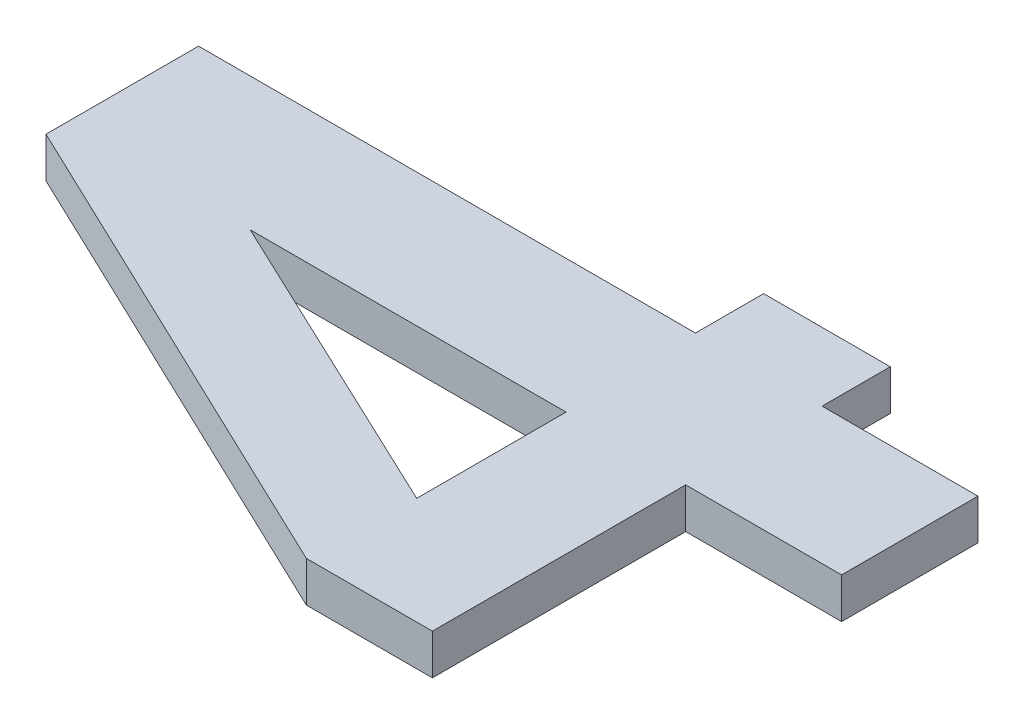
ISO-10303-21;
HEADER;
FILE_DESCRIPTION(('STEP AP214'),'2;1');
FILE_NAME('part.step','',(''),(''),'','','');
FILE_SCHEMA(('AUTOMOTIVE_DESIGN { 1 0 10303 214 1 1 1 1 }'));
ENDSEC;
DATA;
#1=APPLICATION_CONTEXT('core data for automotive mechanical design processes');
#2=APPLICATION_PROTOCOL_DEFINITION('international standard','automotive_design',2000,#1);
#3=PRODUCT_CONTEXT('',#1,'mechanical');
#4=PRODUCT('Part','Part','',(#3));
#5=PRODUCT_RELATED_PRODUCT_CATEGORY('part','',(#4));
#6=PRODUCT_DEFINITION_FORMATION('','',#4);
#7=PRODUCT_DEFINITION_CONTEXT('part definition',#1,'design');
#8=PRODUCT_DEFINITION('design','',#6,#7);
#9=PRODUCT_DEFINITION_SHAPE('','',#8);
#10=(LENGTH_UNIT() NAMED_UNIT(*) SI_UNIT(.MILLI.,.METRE.));
#11=(NAMED_UNIT(*) PLANE_ANGLE_UNIT() SI_UNIT($,.RADIAN.));
#12=(NAMED_UNIT(*) SI_UNIT($,.STERADIAN.) SOLID_ANGLE_UNIT());
#13=UNCERTAINTY_MEASURE_WITH_UNIT(LENGTH_MEASURE(1.E-05),#10,'distance_accuracy_value','');
#14=(GEOMETRIC_REPRESENTATION_CONTEXT(3) GLOBAL_UNCERTAINTY_ASSIGNED_CONTEXT((#13)) GLOBAL_UNIT_ASSIGNED_CONTEXT((#10,
#11,#12)) REPRESENTATION_CONTEXT('',''));
#15=CARTESIAN_POINT('',(0.,0.,0.));
#16=DIRECTION('',(0.,0.,1.));
#17=DIRECTION('',(1.,0.,0.));
#18=AXIS2_PLACEMENT_3D('',#15,#16,#17);
#19=CARTESIAN_POINT('',(0.,2.9906,0.));
#20=DIRECTION('',(0.,-1.,0.));
#21=DIRECTION('',(-1.,0.,0.));
#22=AXIS2_PLACEMENT_3D('',#19,#20,#21);
#23=PLANE('',#22);
#24=DIRECTION('',(0.,0.,1.));
#25=VECTOR('',#24,1.);
#26=CARTESIAN_POINT('',(2.3542541336,2.9906,0.647489118388803));
#27=LINE('',#26,#25);
#28=CARTESIAN_POINT('',(2.3542541336,2.9906,0.647489118388803));
#29=VERTEX_POINT('',#28);
#30=CARTESIAN_POINT('',(2.3542541336,2.9906,0.849711340611025));
#31=VERTEX_POINT('',#30);
#32=EDGE_CURVE('E11',#29,#31,#27,.T.);
#33=ORIENTED_EDGE('',*,*,#32,.F.);
#34=DIRECTION('',(1.,0.,0.));
#35=VECTOR('',#34,1.);
#36=CARTESIAN_POINT('',(2.1231430224888,2.9906,0.647489118388803));
#37=LINE('',#36,#35);
#38=CARTESIAN_POINT('',(2.1231430224888,2.9906,0.647489118388803));
#39=VERTEX_POINT('',#38);
#40=EDGE_CURVE('E24',#39,#29,#37,.T.);
#41=ORIENTED_EDGE('',*,*,#40,.F.);
#42=DIRECTION('',(0.,0.,1.));
#43=VECTOR('',#42,1.);
#44=CARTESIAN_POINT('',(2.1231430224888,2.9906,0.546378007277692));
#45=LINE('',#44,#43);
#46=CARTESIAN_POINT('',(2.1231430224888,2.9906,0.546378007277692));
#47=VERTEX_POINT('',#46);
#48=EDGE_CURVE('E227',#47,#39,#45,.T.);
#49=ORIENTED_EDGE('',*,*,#48,.F.);
#50=DIRECTION('',(1.,0.,0.));
#51=VECTOR('',#50,1.);
#52=CARTESIAN_POINT('',(1.9353652447111,2.9906,0.546378007277692));
#53=LINE('',#52,#51);
#54=CARTESIAN_POINT('',(1.9353652447111,2.9906,0.546378007277692));
#55=VERTEX_POINT('',#54);
#56=EDGE_CURVE('E224',#55,#47,#53,.T.);
#57=ORIENTED_EDGE('',*,*,#56,.F.);
#58=DIRECTION('',(0.,0.,-1.));
#59=VECTOR('',#58,1.);
#60=CARTESIAN_POINT('',(1.9353652447111,2.9906,0.647489118388803));
#61=LINE('',#60,#59);
#62=CARTESIAN_POINT('',(1.9353652447111,2.9906,0.647489118388803));
#63=VERTEX_POINT('',#62);
#64=EDGE_CURVE('E221',#63,#55,#61,.T.);
#65=ORIENTED_EDGE('',*,*,#64,.F.);
#66=DIRECTION('',(1.,0.,0.));
#67=VECTOR('',#66,1.);
#68=CARTESIAN_POINT('',(1.1986985780444,2.9906,0.647489118388803));
#69=LINE('',#68,#67);
#70=CARTESIAN_POINT('',(1.1986985780444,2.9906,0.647489118388803));
#71=VERTEX_POINT('',#70);
#72=EDGE_CURVE('E218',#71,#63,#69,.T.);
#73=ORIENTED_EDGE('',*,*,#72,.F.);
#74=DIRECTION('',(0.,0.,-1.));
#75=VECTOR('',#74,1.);
#76=CARTESIAN_POINT('',(1.1986985780444,2.9906,0.873634951722136));
#77=LINE('',#76,#75);
#78=CARTESIAN_POINT('',(1.1986985780444,2.9906,0.873634951722136));
#79=VERTEX_POINT('',#78);
#80=EDGE_CURVE('E215',#79,#71,#77,.T.);
#81=ORIENTED_EDGE('',*,*,#80,.F.);
#82=DIRECTION('',(-0.902666413566439,0.,-0.430340964607256));
#83=VECTOR('',#82,1.);
#84=CARTESIAN_POINT('',(1.9362680224888,2.9906,1.2252668961666));
#85=LINE('',#84,#83);
#86=CARTESIAN_POINT('',(1.9362680224888,2.9906,1.2252668961666));
#87=VERTEX_POINT('',#86);
#88=EDGE_CURVE('E212',#87,#79,#85,.T.);
#89=ORIENTED_EDGE('',*,*,#88,.F.);
#90=DIRECTION('',(-1.,0.,0.));
#91=VECTOR('',#90,1.);
#92=CARTESIAN_POINT('',(2.1231430224888,2.9906,1.2252668961666));
#93=LINE('',#92,#91);
#94=CARTESIAN_POINT('',(2.1231430224888,2.9906,1.2252668961666));
#95=VERTEX_POINT('',#94);
#96=EDGE_CURVE('E209',#95,#87,#93,.T.);
#97=ORIENTED_EDGE('',*,*,#96,.F.);
#98=DIRECTION('',(0.,0.,1.));
#99=VECTOR('',#98,1.);
#100=CARTESIAN_POINT('',(2.1231430224888,2.9906,0.849711340611025));
#101=LINE('',#100,#99);
#102=CARTESIAN_POINT('',(2.1231430224888,2.9906,0.849711340611025));
#103=VERTEX_POINT('',#102);
#104=EDGE_CURVE('E206',#103,#95,#101,.T.);
#105=ORIENTED_EDGE('',*,*,#104,.F.);
#106=DIRECTION('',(-1.,0.,0.));
#107=VECTOR('',#106,1.);
#108=CARTESIAN_POINT('',(2.3542541336,2.9906,0.849711340611025));
#109=LINE('',#108,#107);
#110=EDGE_CURVE('E203',#31,#103,#109,.T.);
#111=ORIENTED_EDGE('',*,*,#110,.F.);
#112=EDGE_LOOP('',(#33,#41,#49,#57,#65,#73,#81,#89,#97,#105,#111));
#113=FACE_BOUND('',#112,.T.);
#114=DIRECTION('',(0.904056962031246,0.,0.427411990242242));
#115=VECTOR('',#114,1.);
#116=CARTESIAN_POINT('',(1.4726916336,2.9906,0.844971757277692));
#117=LINE('',#116,#115);
#118=CARTESIAN_POINT('',(1.4726916336,2.9906,0.844971757277692));
#119=VERTEX_POINT('',#118);
#120=CARTESIAN_POINT('',(1.9410076058222,2.9906,1.0663780072777));
#121=VERTEX_POINT('',#120);
#122=EDGE_CURVE('E135',#119,#121,#117,.T.);
#123=ORIENTED_EDGE('',*,*,#122,.F.);
#124=DIRECTION('',(-1.,0.,0.));
#125=VECTOR('',#124,1.);
#126=CARTESIAN_POINT('',(1.9410076058222,2.9906,0.844971757277692));
#127=LINE('',#126,#125);
#128=CARTESIAN_POINT('',(1.9410076058222,2.9906,0.844971757277692));
#129=VERTEX_POINT('',#128);
#130=EDGE_CURVE('E199',#129,#119,#127,.T.);
#131=ORIENTED_EDGE('',*,*,#130,.F.);
#132=DIRECTION('',(0.,0.,-1.));
#133=VECTOR('',#132,1.);
#134=CARTESIAN_POINT('',(1.9410076058222,2.9906,1.0663780072777));
#135=LINE('',#134,#133);
#136=EDGE_CURVE('E197',#121,#129,#135,.T.);
#137=ORIENTED_EDGE('',*,*,#136,.F.);
#138=EDGE_LOOP('',(#123,#131,#137));
#139=FACE_BOUND('',#138,.T.);
#140=ADVANCED_FACE('F17',(#113,#139),#23,.F.);
#141=CARTESIAN_POINT('',(0.,2.9306,0.));
#142=DIRECTION('',(0.,-1.,0.));
#143=DIRECTION('',(-1.,0.,0.));
#144=AXIS2_PLACEMENT_3D('',#141,#142,#143);
#145=PLANE('',#144);
#146=DIRECTION('',(0.,0.,1.));
#147=VECTOR('',#146,1.);
#148=CARTESIAN_POINT('',(2.3542541336,2.9306,0.647489118388803));
#149=LINE('',#148,#147);
#150=CARTESIAN_POINT('',(2.3542541336,2.9306,0.647489118388803));
#151=VERTEX_POINT('',#150);
#152=CARTESIAN_POINT('',(2.3542541336,2.9306,0.849711340611025));
#153=VERTEX_POINT('',#152);
#154=EDGE_CURVE('E195',#151,#153,#149,.T.);
#155=ORIENTED_EDGE('',*,*,#154,.T.);
#156=DIRECTION('',(-1.,0.,0.));
#157=VECTOR('',#156,1.);
#158=CARTESIAN_POINT('',(2.3542541336,2.9306,0.849711340611025));
#159=LINE('',#158,#157);
#160=CARTESIAN_POINT('',(2.1231430224888,2.9306,0.849711340611025));
#161=VERTEX_POINT('',#160);
#162=EDGE_CURVE('E193',#153,#161,#159,.T.);
#163=ORIENTED_EDGE('',*,*,#162,.T.);
#164=DIRECTION('',(0.,0.,1.));
#165=VECTOR('',#164,1.);
#166=CARTESIAN_POINT('',(2.1231430224888,2.9306,0.849711340611025));
#167=LINE('',#166,#165);
#168=CARTESIAN_POINT('',(2.1231430224888,2.9306,1.2252668961666));
#169=VERTEX_POINT('',#168);
#170=EDGE_CURVE('E191',#161,#169,#167,.T.);
#171=ORIENTED_EDGE('',*,*,#170,.T.);
#172=DIRECTION('',(-1.,0.,0.));
#173=VECTOR('',#172,1.);
#174=CARTESIAN_POINT('',(2.1231430224888,2.9306,1.2252668961666));
#175=LINE('',#174,#173);
#176=CARTESIAN_POINT('',(1.9362680224888,2.9306,1.2252668961666));
#177=VERTEX_POINT('',#176);
#178=EDGE_CURVE('E189',#169,#177,#175,.T.);
#179=ORIENTED_EDGE('',*,*,#178,.T.);
#180=DIRECTION('',(-0.902666413566439,0.,-0.430340964607256));
#181=VECTOR('',#180,1.);
#182=CARTESIAN_POINT('',(1.9362680224888,2.9306,1.2252668961666));
#183=LINE('',#182,#181);
#184=CARTESIAN_POINT('',(1.1986985780444,2.9306,0.873634951722136));
#185=VERTEX_POINT('',#184);
#186=EDGE_CURVE('E187',#177,#185,#183,.T.);
#187=ORIENTED_EDGE('',*,*,#186,.T.);
#188=DIRECTION('',(0.,0.,-1.));
#189=VECTOR('',#188,1.);
#190=CARTESIAN_POINT('',(1.1986985780444,2.9306,0.873634951722136));
#191=LINE('',#190,#189);
#192=CARTESIAN_POINT('',(1.1986985780444,2.9306,0.647489118388803));
#193=VERTEX_POINT('',#192);
#194=EDGE_CURVE('E185',#185,#193,#191,.T.);
#195=ORIENTED_EDGE('',*,*,#194,.T.);
#196=DIRECTION('',(1.,0.,0.));
#197=VECTOR('',#196,1.);
#198=CARTESIAN_POINT('',(1.1986985780444,2.9306,0.647489118388803));
#199=LINE('',#198,#197);
#200=CARTESIAN_POINT('',(1.9353652447111,2.9306,0.647489118388803));
#201=VERTEX_POINT('',#200);
#202=EDGE_CURVE('E183',#193,#201,#199,.T.);
#203=ORIENTED_EDGE('',*,*,#202,.T.);
#204=DIRECTION('',(0.,0.,-1.));
#205=VECTOR('',#204,1.);
#206=CARTESIAN_POINT('',(1.9353652447111,2.9306,0.647489118388803));
#207=LINE('',#206,#205);
#208=CARTESIAN_POINT('',(1.9353652447111,2.9306,0.546378007277692));
#209=VERTEX_POINT('',#208);
#210=EDGE_CURVE('E181',#201,#209,#207,.T.);
#211=ORIENTED_EDGE('',*,*,#210,.T.);
#212=DIRECTION('',(1.,0.,0.));
#213=VECTOR('',#212,1.);
#214=CARTESIAN_POINT('',(1.9353652447111,2.9306,0.546378007277692));
#215=LINE('',#214,#213);
#216=CARTESIAN_POINT('',(2.1231430224888,2.9306,0.546378007277692));
#217=VERTEX_POINT('',#216);
#218=EDGE_CURVE('E179',#209,#217,#215,.T.);
#219=ORIENTED_EDGE('',*,*,#218,.T.);
#220=DIRECTION('',(0.,0.,1.));
#221=VECTOR('',#220,1.);
#222=CARTESIAN_POINT('',(2.1231430224888,2.9306,0.546378007277692));
#223=LINE('',#222,#221);
#224=CARTESIAN_POINT('',(2.1231430224888,2.9306,0.647489118388803));
#225=VERTEX_POINT('',#224);
#226=EDGE_CURVE('E177',#217,#225,#223,.T.);
#227=ORIENTED_EDGE('',*,*,#226,.T.);
#228=DIRECTION('',(1.,0.,0.));
#229=VECTOR('',#228,1.);
#230=CARTESIAN_POINT('',(2.1231430224888,2.9306,0.647489118388803));
#231=LINE('',#230,#229);
#232=EDGE_CURVE('E174',#225,#151,#231,.T.);
#233=ORIENTED_EDGE('',*,*,#232,.T.);
#234=EDGE_LOOP('',(#155,#163,#171,#179,#187,#195,#203,#211,#219,#227,#233));
#235=FACE_BOUND('',#234,.T.);
#236=DIRECTION('',(-1.,0.,0.));
#237=VECTOR('',#236,1.);
#238=CARTESIAN_POINT('',(1.9410076058222,2.9306,0.844971757277692));
#239=LINE('',#238,#237);
#240=CARTESIAN_POINT('',(1.9410076058222,2.9306,0.844971757277692));
#241=VERTEX_POINT('',#240);
#242=CARTESIAN_POINT('',(1.4726916336,2.9306,0.844971757277692));
#243=VERTEX_POINT('',#242);
#244=EDGE_CURVE('E119',#241,#243,#239,.T.);
#245=ORIENTED_EDGE('',*,*,#244,.T.);
#246=DIRECTION('',(0.904056962031246,0.,0.427411990242242));
#247=VECTOR('',#246,1.);
#248=CARTESIAN_POINT('',(1.4726916336,2.9306,0.844971757277692));
#249=LINE('',#248,#247);
#250=CARTESIAN_POINT('',(1.9410076058222,2.9306,1.0663780072777));
#251=VERTEX_POINT('',#250);
#252=EDGE_CURVE('E114',#243,#251,#249,.T.);
#253=ORIENTED_EDGE('',*,*,#252,.T.);
#254=DIRECTION('',(0.,0.,-1.));
#255=VECTOR('',#254,1.);
#256=CARTESIAN_POINT('',(1.9410076058222,2.9306,1.0663780072777));
#257=LINE('',#256,#255);
#258=EDGE_CURVE('E117',#251,#241,#257,.T.);
#259=ORIENTED_EDGE('',*,*,#258,.T.);
#260=EDGE_LOOP('',(#245,#253,#259));
#261=FACE_BOUND('',#260,.T.);
#262=ADVANCED_FACE('F116',(#235,#261),#145,.T.);
#263=CARTESIAN_POINT('',(2.3542541336,2.9906,0.647489118388803));
#264=DIRECTION('',(1.,0.,0.));
#265=DIRECTION('',(0.,-1.,0.));
#266=AXIS2_PLACEMENT_3D('',#263,#264,#265);
#267=PLANE('',#266);
#268=ORIENTED_EDGE('',*,*,#154,.F.);
#269=DIRECTION('',(0.,-1.,0.));
#270=VECTOR('',#269,1.);
#271=CARTESIAN_POINT('',(2.3542541336,2.9906,0.647489118388803));
#272=LINE('',#271,#270);
#273=EDGE_CURVE('E132',#29,#151,#272,.T.);
#274=ORIENTED_EDGE('',*,*,#273,.F.);
#275=ORIENTED_EDGE('',*,*,#32,.T.);
#276=DIRECTION('',(0.,-1.,0.));
#277=VECTOR('',#276,1.);
#278=CARTESIAN_POINT('',(2.3542541336,2.9906,0.849711340611025));
#279=LINE('',#278,#277);
#280=EDGE_CURVE('E169',#31,#153,#279,.T.);
#281=ORIENTED_EDGE('',*,*,#280,.T.);
#282=EDGE_LOOP('',(#268,#274,#275,#281));
#283=FACE_BOUND('',#282,.T.);
#284=ADVANCED_FACE('F233',(#283),#267,.T.);
#285=CARTESIAN_POINT('',(2.1231430224888,2.9906,0.647489118388803));
#286=DIRECTION('',(0.,0.,-1.));
#287=DIRECTION('',(0.,1.,0.));
#288=AXIS2_PLACEMENT_3D('',#285,#286,#287);
#289=PLANE('',#288);
#290=ORIENTED_EDGE('',*,*,#232,.F.);
#291=DIRECTION('',(0.,-1.,0.));
#292=VECTOR('',#291,1.);
#293=CARTESIAN_POINT('',(2.1231430224888,2.9906,0.647489118388803));
#294=LINE('',#293,#292);
#295=EDGE_CURVE('E166',#39,#225,#294,.T.);
#296=ORIENTED_EDGE('',*,*,#295,.F.);
#297=ORIENTED_EDGE('',*,*,#40,.T.);
#298=ORIENTED_EDGE('',*,*,#273,.T.);
#299=EDGE_LOOP('',(#290,#296,#297,#298));
#300=FACE_BOUND('',#299,.T.);
#301=ADVANCED_FACE('F232',(#300),#289,.T.);
#302=CARTESIAN_POINT('',(2.1231430224888,2.9906,0.546378007277692));
#303=DIRECTION('',(1.,0.,0.));
#304=DIRECTION('',(0.,-1.,0.));
#305=AXIS2_PLACEMENT_3D('',#302,#303,#304);
#306=PLANE('',#305);
#307=ORIENTED_EDGE('',*,*,#226,.F.);
#308=DIRECTION('',(0.,-1.,0.));
#309=VECTOR('',#308,1.);
#310=CARTESIAN_POINT('',(2.1231430224888,2.9906,0.546378007277692));
#311=LINE('',#310,#309);
#312=EDGE_CURVE('E163',#47,#217,#311,.T.);
#313=ORIENTED_EDGE('',*,*,#312,.F.);
#314=ORIENTED_EDGE('',*,*,#48,.T.);
#315=ORIENTED_EDGE('',*,*,#295,.T.);
#316=EDGE_LOOP('',(#307,#313,#314,#315));
#317=FACE_BOUND('',#316,.T.);
#318=ADVANCED_FACE('F239',(#317),#306,.T.);
#319=CARTESIAN_POINT('',(1.9353652447111,2.9906,0.546378007277692));
#320=DIRECTION('',(0.,0.,-1.));
#321=DIRECTION('',(0.,1.,0.));
#322=AXIS2_PLACEMENT_3D('',#319,#320,#321);
#323=PLANE('',#322);
#324=ORIENTED_EDGE('',*,*,#218,.F.);
#325=DIRECTION('',(0.,-1.,0.));
#326=VECTOR('',#325,1.);
#327=CARTESIAN_POINT('',(1.9353652447111,2.9906,0.546378007277692));
#328=LINE('',#327,#326);
#329=EDGE_CURVE('E160',#55,#209,#328,.T.);
#330=ORIENTED_EDGE('',*,*,#329,.F.);
#331=ORIENTED_EDGE('',*,*,#56,.T.);
#332=ORIENTED_EDGE('',*,*,#312,.T.);
#333=EDGE_LOOP('',(#324,#330,#331,#332));
#334=FACE_BOUND('',#333,.T.);
#335=ADVANCED_FACE('F245',(#334),#323,.T.);
#336=CARTESIAN_POINT('',(1.9353652447111,2.9906,0.647489118388803));
#337=DIRECTION('',(-1.,0.,0.));
#338=DIRECTION('',(0.,1.,0.));
#339=AXIS2_PLACEMENT_3D('',#336,#337,#338);
#340=PLANE('',#339);
#341=ORIENTED_EDGE('',*,*,#210,.F.);
#342=DIRECTION('',(0.,-1.,0.));
#343=VECTOR('',#342,1.);
#344=CARTESIAN_POINT('',(1.9353652447111,2.9906,0.647489118388803));
#345=LINE('',#344,#343);
#346=EDGE_CURVE('E157',#63,#201,#345,.T.);
#347=ORIENTED_EDGE('',*,*,#346,.F.);
#348=ORIENTED_EDGE('',*,*,#64,.T.);
#349=ORIENTED_EDGE('',*,*,#329,.T.);
#350=EDGE_LOOP('',(#341,#347,#348,#349));
#351=FACE_BOUND('',#350,.T.);
#352=ADVANCED_FACE('F248',(#351),#340,.T.);
#353=CARTESIAN_POINT('',(1.1986985780444,2.9906,0.647489118388803));
#354=DIRECTION('',(0.,0.,-1.));
#355=DIRECTION('',(0.,1.,0.));
#356=AXIS2_PLACEMENT_3D('',#353,#354,#355);
#357=PLANE('',#356);
#358=ORIENTED_EDGE('',*,*,#202,.F.);
#359=DIRECTION('',(0.,-1.,0.));
#360=VECTOR('',#359,1.);
#361=CARTESIAN_POINT('',(1.1986985780444,2.9906,0.647489118388803));
#362=LINE('',#361,#360);
#363=EDGE_CURVE('E154',#71,#193,#362,.T.);
#364=ORIENTED_EDGE('',*,*,#363,.F.);
#365=ORIENTED_EDGE('',*,*,#72,.T.);
#366=ORIENTED_EDGE('',*,*,#346,.T.);
#367=EDGE_LOOP('',(#358,#364,#365,#366));
#368=FACE_BOUND('',#367,.T.);
#369=ADVANCED_FACE('F253',(#368),#357,.T.);
#370=CARTESIAN_POINT('',(1.1986985780444,2.9906,0.873634951722136));
#371=DIRECTION('',(-1.,0.,0.));
#372=DIRECTION('',(0.,1.,0.));
#373=AXIS2_PLACEMENT_3D('',#370,#371,#372);
#374=PLANE('',#373);
#375=ORIENTED_EDGE('',*,*,#194,.F.);
#376=DIRECTION('',(0.,-1.,0.));
#377=VECTOR('',#376,1.);
#378=CARTESIAN_POINT('',(1.1986985780444,2.9906,0.873634951722136));
#379=LINE('',#378,#377);
#380=EDGE_CURVE('E151',#79,#185,#379,.T.);
#381=ORIENTED_EDGE('',*,*,#380,.F.);
#382=ORIENTED_EDGE('',*,*,#80,.T.);
#383=ORIENTED_EDGE('',*,*,#363,.T.);
#384=EDGE_LOOP('',(#375,#381,#382,#383));
#385=FACE_BOUND('',#384,.T.);
#386=ADVANCED_FACE('F256',(#385),#374,.T.);
#387=CARTESIAN_POINT('',(1.9362680224888,2.9906,1.2252668961666));
#388=DIRECTION('',(-0.430340964607256,0.,0.902666413566439));
#389=DIRECTION('',(0.902666413566439,0.,0.430340964607256));
#390=AXIS2_PLACEMENT_3D('',#387,#388,#389);
#391=PLANE('',#390);
#392=ORIENTED_EDGE('',*,*,#186,.F.);
#393=DIRECTION('',(0.,-1.,0.));
#394=VECTOR('',#393,1.);
#395=CARTESIAN_POINT('',(1.9362680224888,2.9906,1.2252668961666));
#396=LINE('',#395,#394);
#397=EDGE_CURVE('E148',#87,#177,#396,.T.);
#398=ORIENTED_EDGE('',*,*,#397,.F.);
#399=ORIENTED_EDGE('',*,*,#88,.T.);
#400=ORIENTED_EDGE('',*,*,#380,.T.);
#401=EDGE_LOOP('',(#392,#398,#399,#400));
#402=FACE_BOUND('',#401,.T.);
#403=ADVANCED_FACE('F261',(#402),#391,.T.);
#404=CARTESIAN_POINT('',(2.1231430224888,2.9906,1.2252668961666));
#405=DIRECTION('',(0.,0.,1.));
#406=DIRECTION('',(0.,-1.,0.));
#407=AXIS2_PLACEMENT_3D('',#404,#405,#406);
#408=PLANE('',#407);
#409=ORIENTED_EDGE('',*,*,#178,.F.);
#410=DIRECTION('',(0.,-1.,0.));
#411=VECTOR('',#410,1.);
#412=CARTESIAN_POINT('',(2.1231430224888,2.9906,1.2252668961666));
#413=LINE('',#412,#411);
#414=EDGE_CURVE('E145',#95,#169,#413,.T.);
#415=ORIENTED_EDGE('',*,*,#414,.F.);
#416=ORIENTED_EDGE('',*,*,#96,.T.);
#417=ORIENTED_EDGE('',*,*,#397,.T.);
#418=EDGE_LOOP('',(#409,#415,#416,#417));
#419=FACE_BOUND('',#418,.T.);
#420=ADVANCED_FACE('F264',(#419),#408,.T.);
#421=CARTESIAN_POINT('',(2.1231430224888,2.9906,0.849711340611025));
#422=DIRECTION('',(1.,0.,0.));
#423=DIRECTION('',(0.,-1.,0.));
#424=AXIS2_PLACEMENT_3D('',#421,#422,#423);
#425=PLANE('',#424);
#426=ORIENTED_EDGE('',*,*,#170,.F.);
#427=DIRECTION('',(0.,-1.,0.));
#428=VECTOR('',#427,1.);
#429=CARTESIAN_POINT('',(2.1231430224888,2.9906,0.849711340611025));
#430=LINE('',#429,#428);
#431=EDGE_CURVE('E139',#103,#161,#430,.T.);
#432=ORIENTED_EDGE('',*,*,#431,.F.);
#433=ORIENTED_EDGE('',*,*,#104,.T.);
#434=ORIENTED_EDGE('',*,*,#414,.T.);
#435=EDGE_LOOP('',(#426,#432,#433,#434));
#436=FACE_BOUND('',#435,.T.);
#437=ADVANCED_FACE('F269',(#436),#425,.T.);
#438=CARTESIAN_POINT('',(2.3542541336,2.9906,0.849711340611025));
#439=DIRECTION('',(0.,0.,1.));
#440=DIRECTION('',(0.,-1.,0.));
#441=AXIS2_PLACEMENT_3D('',#438,#439,#440);
#442=PLANE('',#441);
#443=ORIENTED_EDGE('',*,*,#162,.F.);
#444=ORIENTED_EDGE('',*,*,#280,.F.);
#445=ORIENTED_EDGE('',*,*,#110,.T.);
#446=ORIENTED_EDGE('',*,*,#431,.T.);
#447=EDGE_LOOP('',(#443,#444,#445,#446));
#448=FACE_BOUND('',#447,.T.);
#449=ADVANCED_FACE('F271',(#448),#442,.T.);
#450=CARTESIAN_POINT('',(1.4726916336,2.9906,0.844971757277692));
#451=DIRECTION('',(0.427411990242242,0.,-0.904056962031246));
#452=DIRECTION('',(-0.904056962031246,0.,-0.427411990242242));
#453=AXIS2_PLACEMENT_3D('',#450,#451,#452);
#454=PLANE('',#453);
#455=ORIENTED_EDGE('',*,*,#252,.F.);
#456=DIRECTION('',(0.,-1.,0.));
#457=VECTOR('',#456,1.);
#458=CARTESIAN_POINT('',(1.4726916336,2.9906,0.844971757277692));
#459=LINE('',#458,#457);
#460=EDGE_CURVE('E137',#119,#243,#459,.T.);
#461=ORIENTED_EDGE('',*,*,#460,.F.);
#462=ORIENTED_EDGE('',*,*,#122,.T.);
#463=DIRECTION('',(0.,-1.,0.));
#464=VECTOR('',#463,1.);
#465=CARTESIAN_POINT('',(1.9410076058222,2.9906,1.0663780072777));
#466=LINE('',#465,#464);
#467=EDGE_CURVE('E129',#121,#251,#466,.T.);
#468=ORIENTED_EDGE('',*,*,#467,.T.);
#469=EDGE_LOOP('',(#455,#461,#462,#468));
#470=FACE_BOUND('',#469,.T.);
#471=ADVANCED_FACE('F134',(#470),#454,.T.);
#472=CARTESIAN_POINT('',(1.9410076058222,2.9906,1.0663780072777));
#473=DIRECTION('',(-1.,0.,0.));
#474=DIRECTION('',(0.,1.,0.));
#475=AXIS2_PLACEMENT_3D('',#472,#473,#474);
#476=PLANE('',#475);
#477=ORIENTED_EDGE('',*,*,#258,.F.);
#478=ORIENTED_EDGE('',*,*,#467,.F.);
#479=ORIENTED_EDGE('',*,*,#136,.T.);
#480=DIRECTION('',(0.,-1.,0.));
#481=VECTOR('',#480,1.);
#482=CARTESIAN_POINT('',(1.9410076058222,2.9906,0.844971757277692));
#483=LINE('',#482,#481);
#484=EDGE_CURVE('E131',#129,#241,#483,.T.);
#485=ORIENTED_EDGE('',*,*,#484,.T.);
#486=EDGE_LOOP('',(#477,#478,#479,#485));
#487=FACE_BOUND('',#486,.T.);
#488=ADVANCED_FACE('F127',(#487),#476,.T.);
#489=CARTESIAN_POINT('',(1.9410076058222,2.9906,0.844971757277692));
#490=DIRECTION('',(0.,0.,1.));
#491=DIRECTION('',(0.,-1.,0.));
#492=AXIS2_PLACEMENT_3D('',#489,#490,#491);
#493=PLANE('',#492);
#494=ORIENTED_EDGE('',*,*,#244,.F.);
#495=ORIENTED_EDGE('',*,*,#484,.F.);
#496=ORIENTED_EDGE('',*,*,#130,.T.);
#497=ORIENTED_EDGE('',*,*,#460,.T.);
#498=EDGE_LOOP('',(#494,#495,#496,#497));
#499=FACE_BOUND('',#498,.T.);
#500=ADVANCED_FACE('F340',(#499),#493,.T.);
#501=CLOSED_SHELL('',(#140,#262,#284,#301,#318,#335,#352,#369,#386,#403,#420,#437,#449,#471,
#488,#500));
#502=MANIFOLD_SOLID_BREP('B1',#501);
#503=ADVANCED_BREP_SHAPE_REPRESENTATION('',(#18,#502),#14);
#504=SHAPE_DEFINITION_REPRESENTATION(#9,#503);
ENDSEC;
END-ISO-10303-21;
